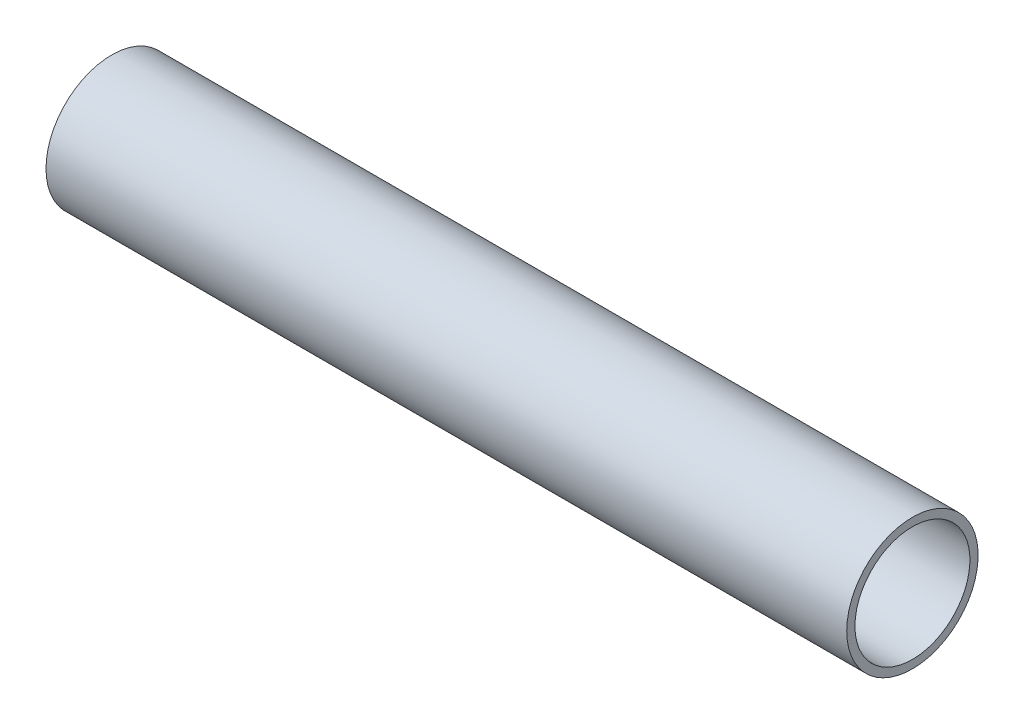
ISO-10303-21;
HEADER;
FILE_DESCRIPTION(('STEP AP214'),'2;1');
FILE_NAME('part.step','',(''),(''),'','','');
FILE_SCHEMA(('AUTOMOTIVE_DESIGN { 1 0 10303 214 1 1 1 1 }'));
ENDSEC;
DATA;
#1=APPLICATION_CONTEXT('core data for automotive mechanical design processes');
#2=APPLICATION_PROTOCOL_DEFINITION('international standard','automotive_design',2000,#1);
#3=PRODUCT_CONTEXT('',#1,'mechanical');
#4=PRODUCT('Part','Part','',(#3));
#5=PRODUCT_RELATED_PRODUCT_CATEGORY('part','',(#4));
#6=PRODUCT_DEFINITION_FORMATION('','',#4);
#7=PRODUCT_DEFINITION_CONTEXT('part definition',#1,'design');
#8=PRODUCT_DEFINITION('design','',#6,#7);
#9=PRODUCT_DEFINITION_SHAPE('','',#8);
#10=(LENGTH_UNIT() NAMED_UNIT(*) SI_UNIT(.MILLI.,.METRE.));
#11=(NAMED_UNIT(*) PLANE_ANGLE_UNIT() SI_UNIT($,.RADIAN.));
#12=(NAMED_UNIT(*) SI_UNIT($,.STERADIAN.) SOLID_ANGLE_UNIT());
#13=UNCERTAINTY_MEASURE_WITH_UNIT(LENGTH_MEASURE(1.E-05),#10,'distance_accuracy_value','');
#14=(GEOMETRIC_REPRESENTATION_CONTEXT(3) GLOBAL_UNCERTAINTY_ASSIGNED_CONTEXT((#13)) GLOBAL_UNIT_ASSIGNED_CONTEXT((#10,
#11,#12)) REPRESENTATION_CONTEXT('',''));
#15=CARTESIAN_POINT('',(0.,0.,0.));
#16=DIRECTION('',(0.,0.,1.));
#17=DIRECTION('',(1.,0.,0.));
#18=AXIS2_PLACEMENT_3D('',#15,#16,#17);
#19=CARTESIAN_POINT('',(-82.9500000000001,0.,0.));
#20=DIRECTION('',(-1.,0.,0.));
#21=DIRECTION('',(0.,0.,1.));
#22=AXIS2_PLACEMENT_3D('',#19,#20,#21);
#23=CYLINDRICAL_SURFACE('',#22,16.);
#24=CARTESIAN_POINT('',(-74.9000000000001,0.,0.));
#25=DIRECTION('',(-1.,0.,0.));
#26=DIRECTION('',(0.,0.,1.));
#27=AXIS2_PLACEMENT_3D('',#24,#25,#26);
#28=CIRCLE('',#27,16.);
#29=CARTESIAN_POINT('',(-74.9000000000001,0.,16.));
#30=VERTEX_POINT('',#29);
#31=EDGE_CURVE('E10',#30,#30,#28,.T.);
#32=ORIENTED_EDGE('',*,*,#31,.F.);
#33=EDGE_LOOP('',(#32));
#34=FACE_BOUND('',#33,.T.);
#35=CARTESIAN_POINT('',(120.1,0.,0.));
#36=DIRECTION('',(-1.,0.,0.));
#37=DIRECTION('',(0.,0.,1.));
#38=AXIS2_PLACEMENT_3D('',#35,#36,#37);
#39=CIRCLE('',#38,16.);
#40=CARTESIAN_POINT('',(120.1,0.,16.));
#41=VERTEX_POINT('',#40);
#42=EDGE_CURVE('E47',#41,#41,#39,.T.);
#43=ORIENTED_EDGE('',*,*,#42,.T.);
#44=EDGE_LOOP('',(#43));
#45=FACE_BOUND('',#44,.T.);
#46=ADVANCED_FACE('F33',(#34,#45),#23,.T.);
#47=CARTESIAN_POINT('',(-74.9000000000001,16.,0.));
#48=DIRECTION('',(1.,0.,0.));
#49=DIRECTION('',(0.,0.,-1.));
#50=AXIS2_PLACEMENT_3D('',#47,#48,#49);
#51=PLANE('',#50);
#52=CARTESIAN_POINT('',(-74.9000000000001,0.,0.));
#53=DIRECTION('',(-1.,0.,0.));
#54=DIRECTION('',(0.,0.,1.));
#55=AXIS2_PLACEMENT_3D('',#52,#53,#54);
#56=CIRCLE('',#55,14.);
#57=CARTESIAN_POINT('',(-74.9000000000001,0.,14.));
#58=VERTEX_POINT('',#57);
#59=EDGE_CURVE('E39',#58,#58,#56,.T.);
#60=ORIENTED_EDGE('',*,*,#59,.F.);
#61=EDGE_LOOP('',(#60));
#62=FACE_BOUND('',#61,.T.);
#63=ORIENTED_EDGE('',*,*,#31,.T.);
#64=EDGE_LOOP('',(#63));
#65=FACE_BOUND('',#64,.T.);
#66=ADVANCED_FACE('F62',(#62,#65),#51,.F.);
#67=CARTESIAN_POINT('',(-82.9500000000001,0.,0.));
#68=DIRECTION('',(-1.,0.,0.));
#69=DIRECTION('',(0.,0.,1.));
#70=AXIS2_PLACEMENT_3D('',#67,#68,#69);
#71=CYLINDRICAL_SURFACE('',#70,14.);
#72=CARTESIAN_POINT('',(120.1,0.,0.));
#73=DIRECTION('',(-1.,0.,0.));
#74=DIRECTION('',(0.,0.,1.));
#75=AXIS2_PLACEMENT_3D('',#72,#73,#74);
#76=CIRCLE('',#75,14.);
#77=CARTESIAN_POINT('',(120.1,0.,14.));
#78=VERTEX_POINT('',#77);
#79=EDGE_CURVE('E43',#78,#78,#76,.T.);
#80=ORIENTED_EDGE('',*,*,#79,.F.);
#81=EDGE_LOOP('',(#80));
#82=FACE_BOUND('',#81,.T.);
#83=ORIENTED_EDGE('',*,*,#59,.T.);
#84=EDGE_LOOP('',(#83));
#85=FACE_BOUND('',#84,.T.);
#86=ADVANCED_FACE('F57',(#82,#85),#71,.F.);
#87=CARTESIAN_POINT('',(120.1,14.,0.));
#88=DIRECTION('',(-1.,0.,0.));
#89=DIRECTION('',(0.,0.,1.));
#90=AXIS2_PLACEMENT_3D('',#87,#88,#89);
#91=PLANE('',#90);
#92=ORIENTED_EDGE('',*,*,#42,.F.);
#93=EDGE_LOOP('',(#92));
#94=FACE_BOUND('',#93,.T.);
#95=ORIENTED_EDGE('',*,*,#79,.T.);
#96=EDGE_LOOP('',(#95));
#97=FACE_BOUND('',#96,.T.);
#98=ADVANCED_FACE('F54',(#94,#97),#91,.F.);
#99=CLOSED_SHELL('',(#46,#66,#86,#98));
#100=MANIFOLD_SOLID_BREP('B2',#99);
#101=ADVANCED_BREP_SHAPE_REPRESENTATION('',(#18,#100),#14);
#102=SHAPE_DEFINITION_REPRESENTATION(#9,#101);
ENDSEC;
END-ISO-10303-21;
